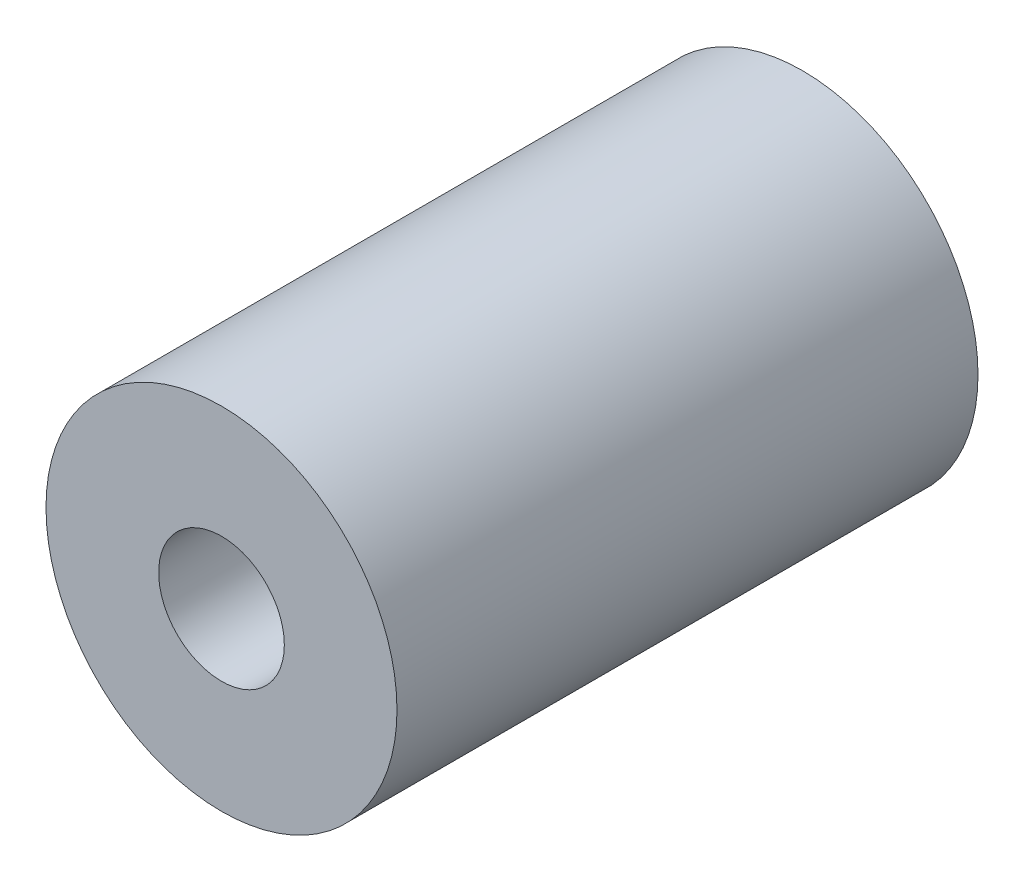
ISO-10303-21;
HEADER;
FILE_DESCRIPTION(('STEP AP214'),'2;1');
FILE_NAME('part.step','',(''),(''),'','','');
FILE_SCHEMA(('AUTOMOTIVE_DESIGN { 1 0 10303 214 1 1 1 1 }'));
ENDSEC;
DATA;
#1=APPLICATION_CONTEXT('core data for automotive mechanical design processes');
#2=APPLICATION_PROTOCOL_DEFINITION('international standard','automotive_design',2000,#1);
#3=PRODUCT_CONTEXT('',#1,'mechanical');
#4=PRODUCT('Part','Part','',(#3));
#5=PRODUCT_RELATED_PRODUCT_CATEGORY('part','',(#4));
#6=PRODUCT_DEFINITION_FORMATION('','',#4);
#7=PRODUCT_DEFINITION_CONTEXT('part definition',#1,'design');
#8=PRODUCT_DEFINITION('design','',#6,#7);
#9=PRODUCT_DEFINITION_SHAPE('','',#8);
#10=(LENGTH_UNIT() NAMED_UNIT(*) SI_UNIT(.MILLI.,.METRE.));
#11=(NAMED_UNIT(*) PLANE_ANGLE_UNIT() SI_UNIT($,.RADIAN.));
#12=(NAMED_UNIT(*) SI_UNIT($,.STERADIAN.) SOLID_ANGLE_UNIT());
#13=UNCERTAINTY_MEASURE_WITH_UNIT(LENGTH_MEASURE(1.E-05),#10,'distance_accuracy_value','');
#14=(GEOMETRIC_REPRESENTATION_CONTEXT(3) GLOBAL_UNCERTAINTY_ASSIGNED_CONTEXT((#13)) GLOBAL_UNIT_ASSIGNED_CONTEXT((#10,
#11,#12)) REPRESENTATION_CONTEXT('',''));
#15=CARTESIAN_POINT('',(0.,0.,0.));
#16=DIRECTION('',(0.,0.,1.));
#17=DIRECTION('',(1.,0.,0.));
#18=AXIS2_PLACEMENT_3D('',#15,#16,#17);
#19=CARTESIAN_POINT('',(0.,0.,24.5));
#20=DIRECTION('',(0.,0.,1.));
#21=DIRECTION('',(1.,0.,0.));
#22=AXIS2_PLACEMENT_3D('',#19,#20,#21);
#23=PLANE('',#22);
#24=CARTESIAN_POINT('',(0.,0.,24.5));
#25=DIRECTION('',(0.,0.,1.));
#26=DIRECTION('',(1.,0.,0.));
#27=AXIS2_PLACEMENT_3D('',#24,#25,#26);
#28=CIRCLE('',#27,2.65);
#29=CARTESIAN_POINT('',(2.65,0.,24.5));
#30=VERTEX_POINT('',#29);
#31=EDGE_CURVE('E10',#30,#30,#28,.T.);
#32=ORIENTED_EDGE('',*,*,#31,.F.);
#33=EDGE_LOOP('',(#32));
#34=FACE_BOUND('',#33,.T.);
#35=CARTESIAN_POINT('',(0.,0.,24.5));
#36=DIRECTION('',(0.,0.,-1.));
#37=DIRECTION('',(-1.,0.,0.));
#38=AXIS2_PLACEMENT_3D('',#35,#36,#37);
#39=CIRCLE('',#38,7.4);
#40=CARTESIAN_POINT('',(-7.4,0.,24.5));
#41=VERTEX_POINT('',#40);
#42=EDGE_CURVE('E54',#41,#41,#39,.T.);
#43=ORIENTED_EDGE('',*,*,#42,.F.);
#44=EDGE_LOOP('',(#43));
#45=FACE_BOUND('',#44,.T.);
#46=ADVANCED_FACE('F41',(#34,#45),#23,.T.);
#47=CARTESIAN_POINT('',(0.,0.,0.));
#48=DIRECTION('',(0.,0.,1.));
#49=DIRECTION('',(1.,0.,0.));
#50=AXIS2_PLACEMENT_3D('',#47,#48,#49);
#51=PLANE('',#50);
#52=CARTESIAN_POINT('',(0.,0.,0.));
#53=DIRECTION('',(0.,0.,1.));
#54=DIRECTION('',(1.,0.,0.));
#55=AXIS2_PLACEMENT_3D('',#52,#53,#54);
#56=CIRCLE('',#55,2.65);
#57=CARTESIAN_POINT('',(2.65,0.,0.));
#58=VERTEX_POINT('',#57);
#59=EDGE_CURVE('E45',#58,#58,#56,.T.);
#60=ORIENTED_EDGE('',*,*,#59,.T.);
#61=EDGE_LOOP('',(#60));
#62=FACE_BOUND('',#61,.T.);
#63=CARTESIAN_POINT('',(0.,0.,0.));
#64=DIRECTION('',(0.,0.,-1.));
#65=DIRECTION('',(-1.,0.,0.));
#66=AXIS2_PLACEMENT_3D('',#63,#64,#65);
#67=CIRCLE('',#66,7.4);
#68=CARTESIAN_POINT('',(-7.4,0.,0.));
#69=VERTEX_POINT('',#68);
#70=EDGE_CURVE('E56',#69,#69,#67,.T.);
#71=ORIENTED_EDGE('',*,*,#70,.T.);
#72=EDGE_LOOP('',(#71));
#73=FACE_BOUND('',#72,.T.);
#74=ADVANCED_FACE('F43',(#62,#73),#51,.F.);
#75=CARTESIAN_POINT('',(0.,0.,24.5));
#76=DIRECTION('',(0.,0.,-1.));
#77=DIRECTION('',(-1.,0.,0.));
#78=AXIS2_PLACEMENT_3D('',#75,#76,#77);
#79=CYLINDRICAL_SURFACE('',#78,2.65);
#80=ORIENTED_EDGE('',*,*,#31,.T.);
#81=EDGE_LOOP('',(#80));
#82=FACE_BOUND('',#81,.T.);
#83=ORIENTED_EDGE('',*,*,#59,.F.);
#84=EDGE_LOOP('',(#83));
#85=FACE_BOUND('',#84,.T.);
#86=ADVANCED_FACE('F72',(#82,#85),#79,.F.);
#87=CARTESIAN_POINT('',(0.,0.,24.5));
#88=DIRECTION('',(0.,0.,-1.));
#89=DIRECTION('',(-1.,0.,0.));
#90=AXIS2_PLACEMENT_3D('',#87,#88,#89);
#91=CYLINDRICAL_SURFACE('',#90,7.4);
#92=ORIENTED_EDGE('',*,*,#42,.T.);
#93=EDGE_LOOP('',(#92));
#94=FACE_BOUND('',#93,.T.);
#95=ORIENTED_EDGE('',*,*,#70,.F.);
#96=EDGE_LOOP('',(#95));
#97=FACE_BOUND('',#96,.T.);
#98=ADVANCED_FACE('F64',(#94,#97),#91,.T.);
#99=CLOSED_SHELL('',(#46,#74,#86,#98));
#100=MANIFOLD_SOLID_BREP('B2',#99);
#101=ADVANCED_BREP_SHAPE_REPRESENTATION('',(#18,#100),#14);
#102=SHAPE_DEFINITION_REPRESENTATION(#9,#101);
ENDSEC;
END-ISO-10303-21;
